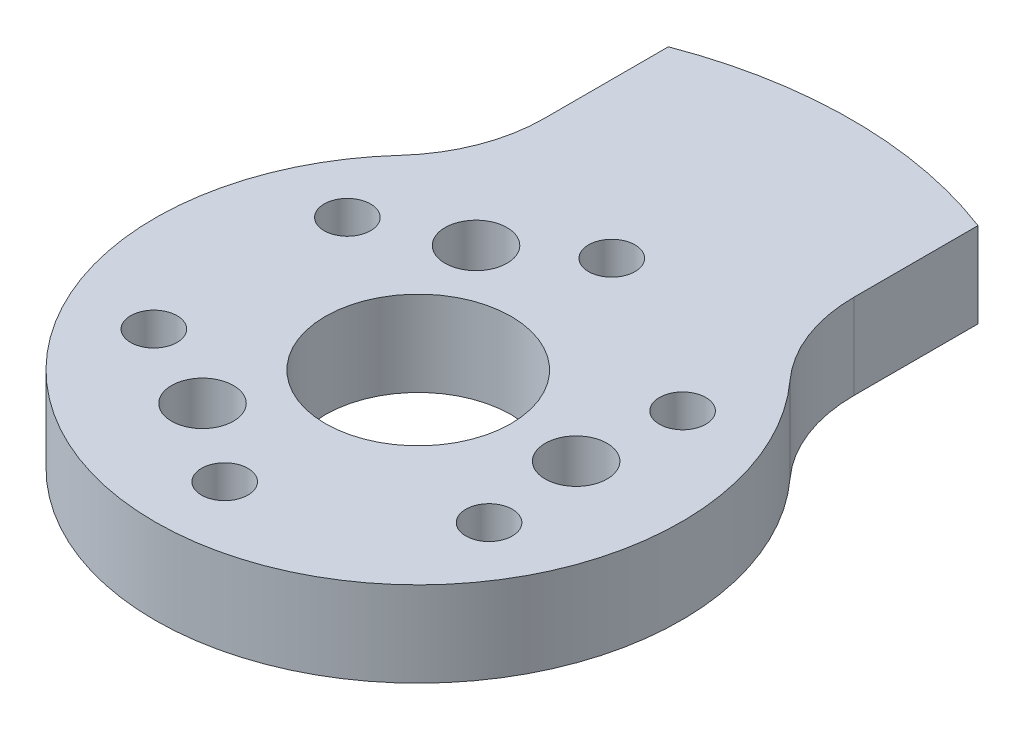
ISO-10303-21;
HEADER;
FILE_DESCRIPTION(('STEP AP214'),'2;1');
FILE_NAME('part.step','',(''),(''),'','','');
FILE_SCHEMA(('AUTOMOTIVE_DESIGN { 1 0 10303 214 1 1 1 1 }'));
ENDSEC;
DATA;
#1=APPLICATION_CONTEXT('core data for automotive mechanical design processes');
#2=APPLICATION_PROTOCOL_DEFINITION('international standard','automotive_design',2000,#1);
#3=PRODUCT_CONTEXT('',#1,'mechanical');
#4=PRODUCT('Part','Part','',(#3));
#5=PRODUCT_RELATED_PRODUCT_CATEGORY('part','',(#4));
#6=PRODUCT_DEFINITION_FORMATION('','',#4);
#7=PRODUCT_DEFINITION_CONTEXT('part definition',#1,'design');
#8=PRODUCT_DEFINITION('design','',#6,#7);
#9=PRODUCT_DEFINITION_SHAPE('','',#8);
#10=(LENGTH_UNIT() NAMED_UNIT(*) SI_UNIT(.MILLI.,.METRE.));
#11=(NAMED_UNIT(*) PLANE_ANGLE_UNIT() SI_UNIT($,.RADIAN.));
#12=(NAMED_UNIT(*) SI_UNIT($,.STERADIAN.) SOLID_ANGLE_UNIT());
#13=UNCERTAINTY_MEASURE_WITH_UNIT(LENGTH_MEASURE(1.E-05),#10,'distance_accuracy_value','');
#14=(GEOMETRIC_REPRESENTATION_CONTEXT(3) GLOBAL_UNCERTAINTY_ASSIGNED_CONTEXT((#13)) GLOBAL_UNIT_ASSIGNED_CONTEXT((#10,
#11,#12)) REPRESENTATION_CONTEXT('',''));
#15=CARTESIAN_POINT('',(0.,0.,0.));
#16=DIRECTION('',(0.,0.,1.));
#17=DIRECTION('',(1.,0.,0.));
#18=AXIS2_PLACEMENT_3D('',#15,#16,#17);
#19=CARTESIAN_POINT('',(0.,5.5,0.));
#20=DIRECTION('',(0.,1.,0.));
#21=DIRECTION('',(0.,0.,1.));
#22=AXIS2_PLACEMENT_3D('',#19,#20,#21);
#23=PLANE('',#22);
#24=CARTESIAN_POINT('',(0.,5.5,12.5000000000133));
#25=DIRECTION('',(0.,1.,0.));
#26=DIRECTION('',(0.,0.,1.));
#27=AXIS2_PLACEMENT_3D('',#24,#25,#26);
#28=CIRCLE('',#27,1.50000000000307);
#29=CARTESIAN_POINT('',(0.,5.5,14.0000000000163));
#30=VERTEX_POINT('',#29);
#31=EDGE_CURVE('E197',#30,#30,#28,.T.);
#32=ORIENTED_EDGE('',*,*,#31,.F.);
#33=EDGE_LOOP('',(#32));
#34=FACE_BOUND('',#33,.T.);
#35=CARTESIAN_POINT('',(10.825317547317,5.5,-6.25000000000709));
#36=DIRECTION('',(0.,1.,0.));
#37=DIRECTION('',(0.,0.,1.));
#38=AXIS2_PLACEMENT_3D('',#35,#36,#37);
#39=CIRCLE('',#38,1.50000000000345);
#40=CARTESIAN_POINT('',(10.825317547317,5.5,-4.75000000000364));
#41=VERTEX_POINT('',#40);
#42=EDGE_CURVE('E185',#41,#41,#39,.T.);
#43=ORIENTED_EDGE('',*,*,#42,.F.);
#44=EDGE_LOOP('',(#43));
#45=FACE_BOUND('',#44,.T.);
#46=CARTESIAN_POINT('',(-5.09999999999966,5.5,8.8334591186006));
#47=DIRECTION('',(0.,1.,0.));
#48=DIRECTION('',(0.,0.,1.));
#49=AXIS2_PLACEMENT_3D('',#46,#47,#48);
#50=CIRCLE('',#49,2.00000000000026);
#51=CARTESIAN_POINT('',(-5.09999999999966,5.5,10.8334591186009));
#52=VERTEX_POINT('',#51);
#53=EDGE_CURVE('E173',#52,#52,#50,.T.);
#54=ORIENTED_EDGE('',*,*,#53,.F.);
#55=EDGE_LOOP('',(#54));
#56=FACE_BOUND('',#55,.T.);
#57=CARTESIAN_POINT('',(0.,5.5,0.));
#58=DIRECTION('',(0.,1.,0.));
#59=DIRECTION('',(0.,0.,1.));
#60=AXIS2_PLACEMENT_3D('',#57,#58,#59);
#61=CIRCLE('',#60,6.);
#62=CARTESIAN_POINT('',(0.,5.5,6.));
#63=VERTEX_POINT('',#62);
#64=EDGE_CURVE('E161',#63,#63,#61,.T.);
#65=ORIENTED_EDGE('',*,*,#64,.F.);
#66=EDGE_LOOP('',(#65));
#67=FACE_BOUND('',#66,.T.);
#68=CARTESIAN_POINT('',(-5.09999999999921,5.5,-8.8334591186013));
#69=DIRECTION('',(0.,1.,0.));
#70=DIRECTION('',(0.,0.,1.));
#71=AXIS2_PLACEMENT_3D('',#68,#69,#70);
#72=CIRCLE('',#71,1.99999999999943);
#73=CARTESIAN_POINT('',(-5.09999999999921,5.5,-6.83345911860186));
#74=VERTEX_POINT('',#73);
#75=EDGE_CURVE('E149',#74,#74,#72,.T.);
#76=ORIENTED_EDGE('',*,*,#75,.F.);
#77=EDGE_LOOP('',(#76));
#78=FACE_BOUND('',#77,.T.);
#79=CARTESIAN_POINT('',(0.,5.5,0.));
#80=DIRECTION('',(0.,1.,0.));
#81=DIRECTION('',(0.,0.,1.));
#82=AXIS2_PLACEMENT_3D('',#79,#80,#81);
#83=CIRCLE('',#82,28.);
#84=CARTESIAN_POINT('',(10.,5.5,-26.153393661244));
#85=VERTEX_POINT('',#84);
#86=CARTESIAN_POINT('',(-10.,5.5,-26.153393661244));
#87=VERTEX_POINT('',#86);
#88=EDGE_CURVE('E96',#85,#87,#83,.T.);
#89=ORIENTED_EDGE('',*,*,#88,.T.);
#90=DIRECTION('',(0.,0.,1.));
#91=VECTOR('',#90,1.);
#92=CARTESIAN_POINT('',(-10.,5.5,-26.153393661244));
#93=LINE('',#92,#91);
#94=CARTESIAN_POINT('',(-10.,5.5,-18.1383571472171));
#95=VERTEX_POINT('',#94);
#96=EDGE_CURVE('E87',#87,#95,#93,.T.);
#97=ORIENTED_EDGE('',*,*,#96,.T.);
#98=CARTESIAN_POINT('',(-20.,5.5,-18.1383571472171));
#99=DIRECTION('',(0.,1.,0.));
#100=DIRECTION('',(0.,0.,1.));
#101=AXIS2_PLACEMENT_3D('',#98,#99,#100);
#102=CIRCLE('',#101,10.);
#103=CARTESIAN_POINT('',(-12.5925925925926,5.5,-11.4204470926922));
#104=VERTEX_POINT('',#103);
#105=EDGE_CURVE('E11',#95,#104,#102,.F.);
#106=ORIENTED_EDGE('',*,*,#105,.T.);
#107=CARTESIAN_POINT('',(0.,5.5,0.));
#108=DIRECTION('',(0.,1.,0.));
#109=DIRECTION('',(0.,0.,1.));
#110=AXIS2_PLACEMENT_3D('',#107,#108,#109);
#111=CIRCLE('',#110,17.);
#112=CARTESIAN_POINT('',(12.5925925925926,5.5,-11.4204470926922));
#113=VERTEX_POINT('',#112);
#114=EDGE_CURVE('E95',#104,#113,#111,.T.);
#115=ORIENTED_EDGE('',*,*,#114,.T.);
#116=CARTESIAN_POINT('',(20.,5.5,-18.1383571472171));
#117=DIRECTION('',(0.,1.,0.));
#118=DIRECTION('',(0.,0.,1.));
#119=AXIS2_PLACEMENT_3D('',#116,#117,#118);
#120=CIRCLE('',#119,10.);
#121=CARTESIAN_POINT('',(10.,5.5,-18.1383571472171));
#122=VERTEX_POINT('',#121);
#123=EDGE_CURVE('E126',#113,#122,#120,.F.);
#124=ORIENTED_EDGE('',*,*,#123,.T.);
#125=DIRECTION('',(0.,0.,-1.));
#126=VECTOR('',#125,1.);
#127=CARTESIAN_POINT('',(10.,5.5,-26.153393661244));
#128=LINE('',#127,#126);
#129=EDGE_CURVE('E101',#122,#85,#128,.T.);
#130=ORIENTED_EDGE('',*,*,#129,.T.);
#131=EDGE_LOOP('',(#89,#97,#106,#115,#124,#130));
#132=FACE_BOUND('',#131,.T.);
#133=CARTESIAN_POINT('',(-10.8253175473174,5.5,-6.25000000000733));
#134=DIRECTION('',(0.,1.,0.));
#135=DIRECTION('',(0.,0.,1.));
#136=AXIS2_PLACEMENT_3D('',#133,#134,#135);
#137=CIRCLE('',#136,1.50000000000272);
#138=CARTESIAN_POINT('',(-10.8253175473174,5.5,-4.75000000000461));
#139=VERTEX_POINT('',#138);
#140=EDGE_CURVE('E155',#139,#139,#137,.T.);
#141=ORIENTED_EDGE('',*,*,#140,.F.);
#142=EDGE_LOOP('',(#141));
#143=FACE_BOUND('',#142,.T.);
#144=CARTESIAN_POINT('',(10.2,5.5,0.));
#145=DIRECTION('',(0.,1.,0.));
#146=DIRECTION('',(0.,0.,1.));
#147=AXIS2_PLACEMENT_3D('',#144,#145,#146);
#148=CIRCLE('',#147,2.);
#149=CARTESIAN_POINT('',(10.2,5.5,2.00000000000004));
#150=VERTEX_POINT('',#149);
#151=EDGE_CURVE('E167',#150,#150,#148,.T.);
#152=ORIENTED_EDGE('',*,*,#151,.F.);
#153=EDGE_LOOP('',(#152));
#154=FACE_BOUND('',#153,.T.);
#155=CARTESIAN_POINT('',(0.,5.5,-12.5000000000142));
#156=DIRECTION('',(0.,1.,0.));
#157=DIRECTION('',(0.,0.,1.));
#158=AXIS2_PLACEMENT_3D('',#155,#156,#157);
#159=CIRCLE('',#158,1.50000000000319);
#160=CARTESIAN_POINT('',(0.,5.5,-11.000000000011));
#161=VERTEX_POINT('',#160);
#162=EDGE_CURVE('E179',#161,#161,#159,.T.);
#163=ORIENTED_EDGE('',*,*,#162,.F.);
#164=EDGE_LOOP('',(#163));
#165=FACE_BOUND('',#164,.T.);
#166=CARTESIAN_POINT('',(10.825317547317,5.5,6.25000000000618));
#167=DIRECTION('',(0.,1.,0.));
#168=DIRECTION('',(0.,0.,1.));
#169=AXIS2_PLACEMENT_3D('',#166,#167,#168);
#170=CIRCLE('',#169,1.50000000000337);
#171=CARTESIAN_POINT('',(10.825317547317,5.5,7.75000000000955));
#172=VERTEX_POINT('',#171);
#173=EDGE_CURVE('E191',#172,#172,#170,.T.);
#174=ORIENTED_EDGE('',*,*,#173,.F.);
#175=EDGE_LOOP('',(#174));
#176=FACE_BOUND('',#175,.T.);
#177=CARTESIAN_POINT('',(-10.8253175473174,5.5,6.25000000000641));
#178=DIRECTION('',(0.,1.,0.));
#179=DIRECTION('',(0.,0.,1.));
#180=AXIS2_PLACEMENT_3D('',#177,#178,#179);
#181=CIRCLE('',#180,1.50000000000277);
#182=CARTESIAN_POINT('',(-10.8253175473174,5.5,7.75000000000918));
#183=VERTEX_POINT('',#182);
#184=EDGE_CURVE('E203',#183,#183,#181,.T.);
#185=ORIENTED_EDGE('',*,*,#184,.F.);
#186=EDGE_LOOP('',(#185));
#187=FACE_BOUND('',#186,.T.);
#188=ADVANCED_FACE('F38',(#34,#45,#56,#67,#78,#132,#143,#154,#165,#176,#187),#23,.T.);
#189=CARTESIAN_POINT('',(0.,0.,0.));
#190=DIRECTION('',(0.,1.,0.));
#191=DIRECTION('',(0.,0.,1.));
#192=AXIS2_PLACEMENT_3D('',#189,#190,#191);
#193=PLANE('',#192);
#194=CARTESIAN_POINT('',(0.,0.,0.));
#195=DIRECTION('',(0.,1.,0.));
#196=DIRECTION('',(0.,0.,1.));
#197=AXIS2_PLACEMENT_3D('',#194,#195,#196);
#198=CIRCLE('',#197,28.);
#199=CARTESIAN_POINT('',(10.,0.,-26.153393661244));
#200=VERTEX_POINT('',#199);
#201=CARTESIAN_POINT('',(-10.,0.,-26.153393661244));
#202=VERTEX_POINT('',#201);
#203=EDGE_CURVE('E109',#200,#202,#198,.T.);
#204=ORIENTED_EDGE('',*,*,#203,.F.);
#205=DIRECTION('',(0.,0.,-1.));
#206=VECTOR('',#205,1.);
#207=CARTESIAN_POINT('',(10.,0.,-26.153393661244));
#208=LINE('',#207,#206);
#209=CARTESIAN_POINT('',(10.,0.,-18.1383571472171));
#210=VERTEX_POINT('',#209);
#211=EDGE_CURVE('E105',#210,#200,#208,.T.);
#212=ORIENTED_EDGE('',*,*,#211,.F.);
#213=CARTESIAN_POINT('',(20.,0.,-18.1383571472171));
#214=DIRECTION('',(0.,1.,0.));
#215=DIRECTION('',(0.,0.,1.));
#216=AXIS2_PLACEMENT_3D('',#213,#214,#215);
#217=CIRCLE('',#216,10.);
#218=CARTESIAN_POINT('',(12.5925925925926,0.,-11.4204470926922));
#219=VERTEX_POINT('',#218);
#220=EDGE_CURVE('E124',#210,#219,#217,.T.);
#221=ORIENTED_EDGE('',*,*,#220,.T.);
#222=CARTESIAN_POINT('',(0.,0.,0.));
#223=DIRECTION('',(0.,1.,0.));
#224=DIRECTION('',(0.,0.,1.));
#225=AXIS2_PLACEMENT_3D('',#222,#223,#224);
#226=CIRCLE('',#225,17.);
#227=CARTESIAN_POINT('',(-12.5925925925926,0.,-11.4204470926922));
#228=VERTEX_POINT('',#227);
#229=EDGE_CURVE('E141',#228,#219,#226,.T.);
#230=ORIENTED_EDGE('',*,*,#229,.F.);
#231=CARTESIAN_POINT('',(-20.,0.,-18.1383571472171));
#232=DIRECTION('',(0.,1.,0.));
#233=DIRECTION('',(0.,0.,1.));
#234=AXIS2_PLACEMENT_3D('',#231,#232,#233);
#235=CIRCLE('',#234,10.);
#236=CARTESIAN_POINT('',(-10.,0.,-18.1383571472171));
#237=VERTEX_POINT('',#236);
#238=EDGE_CURVE('E46',#228,#237,#235,.T.);
#239=ORIENTED_EDGE('',*,*,#238,.T.);
#240=DIRECTION('',(0.,0.,1.));
#241=VECTOR('',#240,1.);
#242=CARTESIAN_POINT('',(-10.,0.,-26.153393661244));
#243=LINE('',#242,#241);
#244=EDGE_CURVE('E145',#202,#237,#243,.T.);
#245=ORIENTED_EDGE('',*,*,#244,.F.);
#246=EDGE_LOOP('',(#204,#212,#221,#230,#239,#245));
#247=FACE_BOUND('',#246,.T.);
#248=CARTESIAN_POINT('',(-5.09999999999921,0.,-8.8334591186013));
#249=DIRECTION('',(0.,1.,0.));
#250=DIRECTION('',(0.,0.,1.));
#251=AXIS2_PLACEMENT_3D('',#248,#249,#250);
#252=CIRCLE('',#251,1.99999999999943);
#253=CARTESIAN_POINT('',(-5.09999999999921,0.,-6.83345911860186));
#254=VERTEX_POINT('',#253);
#255=EDGE_CURVE('E152',#254,#254,#252,.T.);
#256=ORIENTED_EDGE('',*,*,#255,.T.);
#257=EDGE_LOOP('',(#256));
#258=FACE_BOUND('',#257,.T.);
#259=CARTESIAN_POINT('',(-10.8253175473174,0.,-6.25000000000733));
#260=DIRECTION('',(0.,1.,0.));
#261=DIRECTION('',(0.,0.,1.));
#262=AXIS2_PLACEMENT_3D('',#259,#260,#261);
#263=CIRCLE('',#262,1.50000000000272);
#264=CARTESIAN_POINT('',(-10.8253175473174,0.,-4.75000000000461));
#265=VERTEX_POINT('',#264);
#266=EDGE_CURVE('E158',#265,#265,#263,.T.);
#267=ORIENTED_EDGE('',*,*,#266,.T.);
#268=EDGE_LOOP('',(#267));
#269=FACE_BOUND('',#268,.T.);
#270=CARTESIAN_POINT('',(0.,0.,0.));
#271=DIRECTION('',(0.,1.,0.));
#272=DIRECTION('',(0.,0.,1.));
#273=AXIS2_PLACEMENT_3D('',#270,#271,#272);
#274=CIRCLE('',#273,6.);
#275=CARTESIAN_POINT('',(0.,0.,6.));
#276=VERTEX_POINT('',#275);
#277=EDGE_CURVE('E164',#276,#276,#274,.T.);
#278=ORIENTED_EDGE('',*,*,#277,.T.);
#279=EDGE_LOOP('',(#278));
#280=FACE_BOUND('',#279,.T.);
#281=CARTESIAN_POINT('',(10.2,0.,0.));
#282=DIRECTION('',(0.,1.,0.));
#283=DIRECTION('',(0.,0.,1.));
#284=AXIS2_PLACEMENT_3D('',#281,#282,#283);
#285=CIRCLE('',#284,2.);
#286=CARTESIAN_POINT('',(10.2,0.,2.00000000000004));
#287=VERTEX_POINT('',#286);
#288=EDGE_CURVE('E170',#287,#287,#285,.T.);
#289=ORIENTED_EDGE('',*,*,#288,.T.);
#290=EDGE_LOOP('',(#289));
#291=FACE_BOUND('',#290,.T.);
#292=CARTESIAN_POINT('',(-5.09999999999966,0.,8.8334591186006));
#293=DIRECTION('',(0.,1.,0.));
#294=DIRECTION('',(0.,0.,1.));
#295=AXIS2_PLACEMENT_3D('',#292,#293,#294);
#296=CIRCLE('',#295,2.00000000000026);
#297=CARTESIAN_POINT('',(-5.09999999999966,0.,10.8334591186009));
#298=VERTEX_POINT('',#297);
#299=EDGE_CURVE('E176',#298,#298,#296,.T.);
#300=ORIENTED_EDGE('',*,*,#299,.T.);
#301=EDGE_LOOP('',(#300));
#302=FACE_BOUND('',#301,.T.);
#303=CARTESIAN_POINT('',(0.,0.,-12.5000000000142));
#304=DIRECTION('',(0.,1.,0.));
#305=DIRECTION('',(0.,0.,1.));
#306=AXIS2_PLACEMENT_3D('',#303,#304,#305);
#307=CIRCLE('',#306,1.50000000000319);
#308=CARTESIAN_POINT('',(0.,0.,-11.000000000011));
#309=VERTEX_POINT('',#308);
#310=EDGE_CURVE('E182',#309,#309,#307,.T.);
#311=ORIENTED_EDGE('',*,*,#310,.T.);
#312=EDGE_LOOP('',(#311));
#313=FACE_BOUND('',#312,.T.);
#314=CARTESIAN_POINT('',(10.825317547317,0.,-6.25000000000709));
#315=DIRECTION('',(0.,1.,0.));
#316=DIRECTION('',(0.,0.,1.));
#317=AXIS2_PLACEMENT_3D('',#314,#315,#316);
#318=CIRCLE('',#317,1.50000000000345);
#319=CARTESIAN_POINT('',(10.825317547317,0.,-4.75000000000364));
#320=VERTEX_POINT('',#319);
#321=EDGE_CURVE('E188',#320,#320,#318,.T.);
#322=ORIENTED_EDGE('',*,*,#321,.T.);
#323=EDGE_LOOP('',(#322));
#324=FACE_BOUND('',#323,.T.);
#325=CARTESIAN_POINT('',(10.825317547317,0.,6.25000000000618));
#326=DIRECTION('',(0.,1.,0.));
#327=DIRECTION('',(0.,0.,1.));
#328=AXIS2_PLACEMENT_3D('',#325,#326,#327);
#329=CIRCLE('',#328,1.50000000000337);
#330=CARTESIAN_POINT('',(10.825317547317,0.,7.75000000000955));
#331=VERTEX_POINT('',#330);
#332=EDGE_CURVE('E194',#331,#331,#329,.T.);
#333=ORIENTED_EDGE('',*,*,#332,.T.);
#334=EDGE_LOOP('',(#333));
#335=FACE_BOUND('',#334,.T.);
#336=CARTESIAN_POINT('',(0.,0.,12.5000000000133));
#337=DIRECTION('',(0.,1.,0.));
#338=DIRECTION('',(0.,0.,1.));
#339=AXIS2_PLACEMENT_3D('',#336,#337,#338);
#340=CIRCLE('',#339,1.50000000000307);
#341=CARTESIAN_POINT('',(0.,0.,14.0000000000163));
#342=VERTEX_POINT('',#341);
#343=EDGE_CURVE('E200',#342,#342,#340,.T.);
#344=ORIENTED_EDGE('',*,*,#343,.T.);
#345=EDGE_LOOP('',(#344));
#346=FACE_BOUND('',#345,.T.);
#347=CARTESIAN_POINT('',(-10.8253175473174,0.,6.25000000000641));
#348=DIRECTION('',(0.,1.,0.));
#349=DIRECTION('',(0.,0.,1.));
#350=AXIS2_PLACEMENT_3D('',#347,#348,#349);
#351=CIRCLE('',#350,1.50000000000277);
#352=CARTESIAN_POINT('',(-10.8253175473174,0.,7.75000000000918));
#353=VERTEX_POINT('',#352);
#354=EDGE_CURVE('E206',#353,#353,#351,.T.);
#355=ORIENTED_EDGE('',*,*,#354,.T.);
#356=EDGE_LOOP('',(#355));
#357=FACE_BOUND('',#356,.T.);
#358=ADVANCED_FACE('F139',(#247,#258,#269,#280,#291,#302,#313,#324,#335,#346,#357),#193,.F.);
#359=CARTESIAN_POINT('',(0.,5.5,0.));
#360=DIRECTION('',(0.,-1.,0.));
#361=DIRECTION('',(0.,0.,-1.));
#362=AXIS2_PLACEMENT_3D('',#359,#360,#361);
#363=CYLINDRICAL_SURFACE('',#362,28.);
#364=ORIENTED_EDGE('',*,*,#203,.T.);
#365=DIRECTION('',(0.,-1.,0.));
#366=VECTOR('',#365,1.);
#367=CARTESIAN_POINT('',(-10.,5.5,-26.153393661244));
#368=LINE('',#367,#366);
#369=EDGE_CURVE('E91',#87,#202,#368,.T.);
#370=ORIENTED_EDGE('',*,*,#369,.F.);
#371=ORIENTED_EDGE('',*,*,#88,.F.);
#372=DIRECTION('',(0.,-1.,0.));
#373=VECTOR('',#372,1.);
#374=CARTESIAN_POINT('',(10.,5.5,-26.153393661244));
#375=LINE('',#374,#373);
#376=EDGE_CURVE('E111',#85,#200,#375,.T.);
#377=ORIENTED_EDGE('',*,*,#376,.T.);
#378=EDGE_LOOP('',(#364,#370,#371,#377));
#379=FACE_BOUND('',#378,.T.);
#380=ADVANCED_FACE('F107',(#379),#363,.T.);
#381=CARTESIAN_POINT('',(-10.,5.5,-26.153393661244));
#382=DIRECTION('',(1.,0.,0.));
#383=DIRECTION('',(0.,0.,-1.));
#384=AXIS2_PLACEMENT_3D('',#381,#382,#383);
#385=PLANE('',#384);
#386=ORIENTED_EDGE('',*,*,#244,.T.);
#387=DIRECTION('',(0.,1.,0.));
#388=VECTOR('',#387,1.);
#389=CARTESIAN_POINT('',(-10.,5.5,-18.138357147217));
#390=LINE('',#389,#388);
#391=EDGE_CURVE('E53',#237,#95,#390,.T.);
#392=ORIENTED_EDGE('',*,*,#391,.T.);
#393=ORIENTED_EDGE('',*,*,#96,.F.);
#394=ORIENTED_EDGE('',*,*,#369,.T.);
#395=EDGE_LOOP('',(#386,#392,#393,#394));
#396=FACE_BOUND('',#395,.T.);
#397=ADVANCED_FACE('F89',(#396),#385,.F.);
#398=CARTESIAN_POINT('',(0.,5.5,0.));
#399=DIRECTION('',(0.,-1.,0.));
#400=DIRECTION('',(0.,0.,-1.));
#401=AXIS2_PLACEMENT_3D('',#398,#399,#400);
#402=CYLINDRICAL_SURFACE('',#401,17.);
#403=ORIENTED_EDGE('',*,*,#229,.T.);
#404=DIRECTION('',(0.,-1.,0.));
#405=VECTOR('',#404,1.);
#406=CARTESIAN_POINT('',(12.5925925925926,5.5,-11.4204470926922));
#407=LINE('',#406,#405);
#408=EDGE_CURVE('E121',#219,#113,#407,.F.);
#409=ORIENTED_EDGE('',*,*,#408,.T.);
#410=ORIENTED_EDGE('',*,*,#114,.F.);
#411=DIRECTION('',(0.,-1.,0.));
#412=VECTOR('',#411,1.);
#413=CARTESIAN_POINT('',(-12.5925925925926,5.5,-11.4204470926922));
#414=LINE('',#413,#412);
#415=EDGE_CURVE('E114',#104,#228,#414,.T.);
#416=ORIENTED_EDGE('',*,*,#415,.T.);
#417=EDGE_LOOP('',(#403,#409,#410,#416));
#418=FACE_BOUND('',#417,.T.);
#419=ADVANCED_FACE('F143',(#418),#402,.T.);
#420=CARTESIAN_POINT('',(10.,5.5,-26.153393661244));
#421=DIRECTION('',(-1.,0.,0.));
#422=DIRECTION('',(0.,0.,1.));
#423=AXIS2_PLACEMENT_3D('',#420,#421,#422);
#424=PLANE('',#423);
#425=ORIENTED_EDGE('',*,*,#129,.F.);
#426=DIRECTION('',(0.,1.,0.));
#427=VECTOR('',#426,1.);
#428=CARTESIAN_POINT('',(10.,0.,-18.138357147217));
#429=LINE('',#428,#427);
#430=EDGE_CURVE('E110',#122,#210,#429,.F.);
#431=ORIENTED_EDGE('',*,*,#430,.T.);
#432=ORIENTED_EDGE('',*,*,#211,.T.);
#433=ORIENTED_EDGE('',*,*,#376,.F.);
#434=EDGE_LOOP('',(#425,#431,#432,#433));
#435=FACE_BOUND('',#434,.T.);
#436=ADVANCED_FACE('F134',(#435),#424,.F.);
#437=CARTESIAN_POINT('',(-5.09999999999921,5.5,-8.8334591186013));
#438=DIRECTION('',(0.,-1.,0.));
#439=DIRECTION('',(0.,0.,-1.));
#440=AXIS2_PLACEMENT_3D('',#437,#438,#439);
#441=CYLINDRICAL_SURFACE('',#440,1.99999999999943);
#442=ORIENTED_EDGE('',*,*,#75,.T.);
#443=EDGE_LOOP('',(#442));
#444=FACE_BOUND('',#443,.T.);
#445=ORIENTED_EDGE('',*,*,#255,.F.);
#446=EDGE_LOOP('',(#445));
#447=FACE_BOUND('',#446,.T.);
#448=ADVANCED_FACE('F225',(#444,#447),#441,.F.);
#449=CARTESIAN_POINT('',(-10.8253175473174,5.5,-6.25000000000733));
#450=DIRECTION('',(0.,-1.,0.));
#451=DIRECTION('',(0.,0.,-1.));
#452=AXIS2_PLACEMENT_3D('',#449,#450,#451);
#453=CYLINDRICAL_SURFACE('',#452,1.50000000000272);
#454=ORIENTED_EDGE('',*,*,#140,.T.);
#455=EDGE_LOOP('',(#454));
#456=FACE_BOUND('',#455,.T.);
#457=ORIENTED_EDGE('',*,*,#266,.F.);
#458=EDGE_LOOP('',(#457));
#459=FACE_BOUND('',#458,.T.);
#460=ADVANCED_FACE('F271',(#456,#459),#453,.F.);
#461=CARTESIAN_POINT('',(0.,5.5,0.));
#462=DIRECTION('',(0.,-1.,0.));
#463=DIRECTION('',(0.,0.,-1.));
#464=AXIS2_PLACEMENT_3D('',#461,#462,#463);
#465=CYLINDRICAL_SURFACE('',#464,6.);
#466=ORIENTED_EDGE('',*,*,#64,.T.);
#467=EDGE_LOOP('',(#466));
#468=FACE_BOUND('',#467,.T.);
#469=ORIENTED_EDGE('',*,*,#277,.F.);
#470=EDGE_LOOP('',(#469));
#471=FACE_BOUND('',#470,.T.);
#472=ADVANCED_FACE('F268',(#468,#471),#465,.F.);
#473=CARTESIAN_POINT('',(10.2,5.5,0.));
#474=DIRECTION('',(0.,-1.,0.));
#475=DIRECTION('',(0.,0.,-1.));
#476=AXIS2_PLACEMENT_3D('',#473,#474,#475);
#477=CYLINDRICAL_SURFACE('',#476,2.);
#478=ORIENTED_EDGE('',*,*,#151,.T.);
#479=EDGE_LOOP('',(#478));
#480=FACE_BOUND('',#479,.T.);
#481=ORIENTED_EDGE('',*,*,#288,.F.);
#482=EDGE_LOOP('',(#481));
#483=FACE_BOUND('',#482,.T.);
#484=ADVANCED_FACE('F264',(#480,#483),#477,.F.);
#485=CARTESIAN_POINT('',(-5.09999999999966,5.5,8.8334591186006));
#486=DIRECTION('',(0.,-1.,0.));
#487=DIRECTION('',(0.,0.,-1.));
#488=AXIS2_PLACEMENT_3D('',#485,#486,#487);
#489=CYLINDRICAL_SURFACE('',#488,2.00000000000026);
#490=ORIENTED_EDGE('',*,*,#53,.T.);
#491=EDGE_LOOP('',(#490));
#492=FACE_BOUND('',#491,.T.);
#493=ORIENTED_EDGE('',*,*,#299,.F.);
#494=EDGE_LOOP('',(#493));
#495=FACE_BOUND('',#494,.T.);
#496=ADVANCED_FACE('F260',(#492,#495),#489,.F.);
#497=CARTESIAN_POINT('',(0.,5.5,-12.5000000000142));
#498=DIRECTION('',(0.,-1.,0.));
#499=DIRECTION('',(0.,0.,-1.));
#500=AXIS2_PLACEMENT_3D('',#497,#498,#499);
#501=CYLINDRICAL_SURFACE('',#500,1.50000000000319);
#502=ORIENTED_EDGE('',*,*,#162,.T.);
#503=EDGE_LOOP('',(#502));
#504=FACE_BOUND('',#503,.T.);
#505=ORIENTED_EDGE('',*,*,#310,.F.);
#506=EDGE_LOOP('',(#505));
#507=FACE_BOUND('',#506,.T.);
#508=ADVANCED_FACE('F256',(#504,#507),#501,.F.);
#509=CARTESIAN_POINT('',(10.825317547317,5.5,-6.25000000000709));
#510=DIRECTION('',(0.,-1.,0.));
#511=DIRECTION('',(0.,0.,-1.));
#512=AXIS2_PLACEMENT_3D('',#509,#510,#511);
#513=CYLINDRICAL_SURFACE('',#512,1.50000000000345);
#514=ORIENTED_EDGE('',*,*,#42,.T.);
#515=EDGE_LOOP('',(#514));
#516=FACE_BOUND('',#515,.T.);
#517=ORIENTED_EDGE('',*,*,#321,.F.);
#518=EDGE_LOOP('',(#517));
#519=FACE_BOUND('',#518,.T.);
#520=ADVANCED_FACE('F252',(#516,#519),#513,.F.);
#521=CARTESIAN_POINT('',(10.825317547317,5.5,6.25000000000618));
#522=DIRECTION('',(0.,-1.,0.));
#523=DIRECTION('',(0.,0.,-1.));
#524=AXIS2_PLACEMENT_3D('',#521,#522,#523);
#525=CYLINDRICAL_SURFACE('',#524,1.50000000000337);
#526=ORIENTED_EDGE('',*,*,#173,.T.);
#527=EDGE_LOOP('',(#526));
#528=FACE_BOUND('',#527,.T.);
#529=ORIENTED_EDGE('',*,*,#332,.F.);
#530=EDGE_LOOP('',(#529));
#531=FACE_BOUND('',#530,.T.);
#532=ADVANCED_FACE('F246',(#528,#531),#525,.F.);
#533=CARTESIAN_POINT('',(0.,5.5,12.5000000000133));
#534=DIRECTION('',(0.,-1.,0.));
#535=DIRECTION('',(0.,0.,-1.));
#536=AXIS2_PLACEMENT_3D('',#533,#534,#535);
#537=CYLINDRICAL_SURFACE('',#536,1.50000000000307);
#538=ORIENTED_EDGE('',*,*,#31,.T.);
#539=EDGE_LOOP('',(#538));
#540=FACE_BOUND('',#539,.T.);
#541=ORIENTED_EDGE('',*,*,#343,.F.);
#542=EDGE_LOOP('',(#541));
#543=FACE_BOUND('',#542,.T.);
#544=ADVANCED_FACE('F241',(#540,#543),#537,.F.);
#545=CARTESIAN_POINT('',(-10.8253175473174,5.5,6.25000000000641));
#546=DIRECTION('',(0.,-1.,0.));
#547=DIRECTION('',(0.,0.,-1.));
#548=AXIS2_PLACEMENT_3D('',#545,#546,#547);
#549=CYLINDRICAL_SURFACE('',#548,1.50000000000277);
#550=ORIENTED_EDGE('',*,*,#184,.T.);
#551=EDGE_LOOP('',(#550));
#552=FACE_BOUND('',#551,.T.);
#553=ORIENTED_EDGE('',*,*,#354,.F.);
#554=EDGE_LOOP('',(#553));
#555=FACE_BOUND('',#554,.T.);
#556=ADVANCED_FACE('F212',(#552,#555),#549,.F.);
#557=CARTESIAN_POINT('',(20.,5.5,-18.1383571472171));
#558=DIRECTION('',(0.,-1.,0.));
#559=DIRECTION('',(0.,0.,-1.));
#560=AXIS2_PLACEMENT_3D('',#557,#558,#559);
#561=CYLINDRICAL_SURFACE('',#560,10.);
#562=ORIENTED_EDGE('',*,*,#123,.F.);
#563=ORIENTED_EDGE('',*,*,#408,.F.);
#564=ORIENTED_EDGE('',*,*,#220,.F.);
#565=ORIENTED_EDGE('',*,*,#430,.F.);
#566=EDGE_LOOP('',(#562,#563,#564,#565));
#567=FACE_BOUND('',#566,.T.);
#568=ADVANCED_FACE('F137',(#567),#561,.F.);
#569=CARTESIAN_POINT('',(-20.,5.5,-18.1383571472171));
#570=DIRECTION('',(0.,-1.,0.));
#571=DIRECTION('',(0.,0.,-1.));
#572=AXIS2_PLACEMENT_3D('',#569,#570,#571);
#573=CYLINDRICAL_SURFACE('',#572,10.);
#574=ORIENTED_EDGE('',*,*,#105,.F.);
#575=ORIENTED_EDGE('',*,*,#391,.F.);
#576=ORIENTED_EDGE('',*,*,#238,.F.);
#577=ORIENTED_EDGE('',*,*,#415,.F.);
#578=EDGE_LOOP('',(#574,#575,#576,#577));
#579=FACE_BOUND('',#578,.T.);
#580=ADVANCED_FACE('F40',(#579),#573,.F.);
#581=CLOSED_SHELL('',(#188,#358,#380,#397,#419,#436,#448,#460,#472,#484,#496,#508,#520,#532,
#544,#556,#568,#580));
#582=MANIFOLD_SOLID_BREP('B2',#581);
#583=ADVANCED_BREP_SHAPE_REPRESENTATION('',(#18,#582),#14);
#584=SHAPE_DEFINITION_REPRESENTATION(#9,#583);
ENDSEC;
END-ISO-10303-21;
